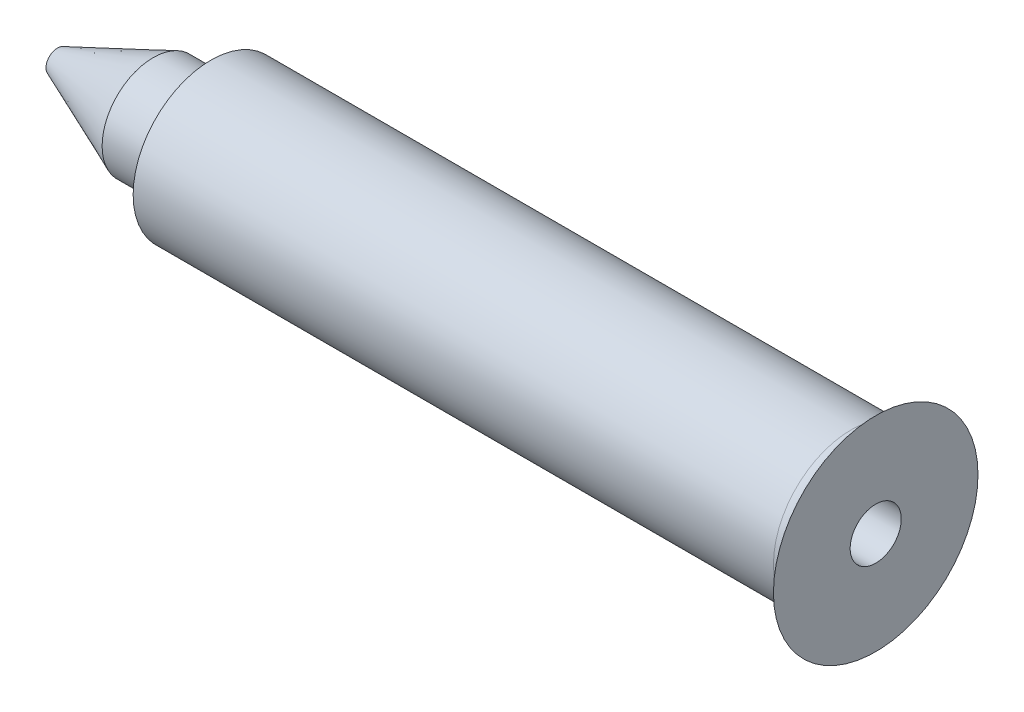
ISO-10303-21;
HEADER;
FILE_DESCRIPTION(('STEP AP214'),'2;1');
FILE_NAME('part.step','',(''),(''),'','','');
FILE_SCHEMA(('AUTOMOTIVE_DESIGN { 1 0 10303 214 1 1 1 1 }'));
ENDSEC;
DATA;
#1=APPLICATION_CONTEXT('core data for automotive mechanical design processes');
#2=APPLICATION_PROTOCOL_DEFINITION('international standard','automotive_design',2000,#1);
#3=PRODUCT_CONTEXT('',#1,'mechanical');
#4=PRODUCT('Part','Part','',(#3));
#5=PRODUCT_RELATED_PRODUCT_CATEGORY('part','',(#4));
#6=PRODUCT_DEFINITION_FORMATION('','',#4);
#7=PRODUCT_DEFINITION_CONTEXT('part definition',#1,'design');
#8=PRODUCT_DEFINITION('design','',#6,#7);
#9=PRODUCT_DEFINITION_SHAPE('','',#8);
#10=(LENGTH_UNIT() NAMED_UNIT(*) SI_UNIT(.MILLI.,.METRE.));
#11=(NAMED_UNIT(*) PLANE_ANGLE_UNIT() SI_UNIT($,.RADIAN.));
#12=(NAMED_UNIT(*) SI_UNIT($,.STERADIAN.) SOLID_ANGLE_UNIT());
#13=UNCERTAINTY_MEASURE_WITH_UNIT(LENGTH_MEASURE(1.E-05),#10,'distance_accuracy_value','');
#14=(GEOMETRIC_REPRESENTATION_CONTEXT(3) GLOBAL_UNCERTAINTY_ASSIGNED_CONTEXT((#13)) GLOBAL_UNIT_ASSIGNED_CONTEXT((#10,
#11,#12)) REPRESENTATION_CONTEXT('',''));
#15=CARTESIAN_POINT('',(0.,0.,0.));
#16=DIRECTION('',(0.,0.,1.));
#17=DIRECTION('',(1.,0.,0.));
#18=AXIS2_PLACEMENT_3D('',#15,#16,#17);
#19=CARTESIAN_POINT('',(2.97406968748741,0.,0.));
#20=DIRECTION('',(1.,0.,0.));
#21=DIRECTION('',(0.,0.,-1.));
#22=AXIS2_PLACEMENT_3D('',#19,#20,#21);
#23=CONICAL_SURFACE('',#22,1.5875,0.392699081698725);
#24=CARTESIAN_POINT('',(0.,0.,0.));
#25=DIRECTION('',(-1.,0.,0.));
#26=DIRECTION('',(0.,0.,1.));
#27=AXIS2_PLACEMENT_3D('',#24,#25,#26);
#28=CIRCLE('',#27,0.3556);
#29=CARTESIAN_POINT('',(0.,0.,-0.3556));
#30=VERTEX_POINT('',#29);
#31=EDGE_CURVE('E82',#30,#30,#28,.T.);
#32=CARTESIAN_POINT('',(2.97406968748741,0.,0.));
#33=DIRECTION('',(-1.,0.,0.));
#34=DIRECTION('',(0.,0.,1.));
#35=AXIS2_PLACEMENT_3D('',#32,#33,#34);
#36=CIRCLE('',#35,1.5875);
#37=CARTESIAN_POINT('',(2.97406968748741,0.,-1.5875));
#38=VERTEX_POINT('',#37);
#39=EDGE_CURVE('E10',#38,#38,#36,.T.);
#40=CARTESIAN_POINT('',(0.,0.,-0.3556));
#41=CARTESIAN_POINT('',(0.0309798925779943,0.,-0.368432291666667));
#42=CARTESIAN_POINT('',(0.0619597851559881,0.,-0.381264583333334));
#43=CARTESIAN_POINT('',(0.123919570311976,0.,-0.406929166666667));
#44=CARTESIAN_POINT('',(0.15489946288997,0.,-0.419761458333334));
#45=CARTESIAN_POINT('',(0.216859248045957,0.,-0.445426041666667));
#46=CARTESIAN_POINT('',(0.247839140623951,0.,-0.458258333333333));
#47=CARTESIAN_POINT('',(0.309798925779939,0.,-0.483922916666667));
#48=CARTESIAN_POINT('',(0.340778818357933,0.,-0.496755208333333));
#49=CARTESIAN_POINT('',(0.402738603513921,0.,-0.522419791666667));
#50=CARTESIAN_POINT('',(0.433718496091914,0.,-0.535252083333333));
#51=CARTESIAN_POINT('',(0.495678281247902,0.,-0.560916666666667));
#52=CARTESIAN_POINT('',(0.526658173825896,0.,-0.573748958333334));
#53=CARTESIAN_POINT('',(0.588617958981884,0.,-0.599413541666667));
#54=CARTESIAN_POINT('',(0.619597851559878,0.,-0.612245833333333));
#55=CARTESIAN_POINT('',(0.681557636715865,0.,-0.637910416666667));
#56=CARTESIAN_POINT('',(0.712537529293859,0.,-0.650742708333333));
#57=CARTESIAN_POINT('',(0.774497314449847,0.,-0.676407291666667));
#58=CARTESIAN_POINT('',(0.805477207027841,0.,-0.689239583333333));
#59=CARTESIAN_POINT('',(0.867436992183828,0.,-0.714904166666667));
#60=CARTESIAN_POINT('',(0.898416884761822,0.,-0.727736458333333));
#61=CARTESIAN_POINT('',(0.96037666991781,0.,-0.753401041666667));
#62=CARTESIAN_POINT('',(0.991356562495804,0.,-0.766233333333334));
#63=CARTESIAN_POINT('',(1.05331634765179,0.,-0.791897916666667));
#64=CARTESIAN_POINT('',(1.08429624022979,0.,-0.804730208333333));
#65=CARTESIAN_POINT('',(1.14625602538577,0.,-0.830394791666667));
#66=CARTESIAN_POINT('',(1.17723591796377,0.,-0.843227083333334));
#67=CARTESIAN_POINT('',(1.23919570311975,0.,-0.868891666666667));
#68=CARTESIAN_POINT('',(1.27017559569775,0.,-0.881723958333334));
#69=CARTESIAN_POINT('',(1.33213538085374,0.,-0.907388541666667));
#70=CARTESIAN_POINT('',(1.36311527343173,0.,-0.920220833333333));
#71=CARTESIAN_POINT('',(1.42507505858772,0.,-0.945885416666667));
#72=CARTESIAN_POINT('',(1.45605495116571,0.,-0.958717708333333));
#73=CARTESIAN_POINT('',(1.5180147363217,0.,-0.984382291666667));
#74=CARTESIAN_POINT('',(1.54899462889969,0.,-0.997214583333333));
#75=CARTESIAN_POINT('',(1.61095441405568,0.,-1.02287916666667));
#76=CARTESIAN_POINT('',(1.64193430663367,0.,-1.03571145833333));
#77=CARTESIAN_POINT('',(1.70389409178966,0.,-1.06137604166667));
#78=CARTESIAN_POINT('',(1.73487398436766,0.,-1.07420833333333));
#79=CARTESIAN_POINT('',(1.79683376952364,0.,-1.09987291666667));
#80=CARTESIAN_POINT('',(1.82781366210164,0.,-1.11270520833333));
#81=CARTESIAN_POINT('',(1.88977344725763,0.,-1.13836979166667));
#82=CARTESIAN_POINT('',(1.92075333983562,0.,-1.15120208333333));
#83=CARTESIAN_POINT('',(1.98271312499161,0.,-1.17686666666667));
#84=CARTESIAN_POINT('',(2.0136930175696,0.,-1.18969895833333));
#85=CARTESIAN_POINT('',(2.07565280272559,0.,-1.21536354166667));
#86=CARTESIAN_POINT('',(2.10663269530358,0.,-1.22819583333333));
#87=CARTESIAN_POINT('',(2.16859248045957,0.,-1.25386041666667));
#88=CARTESIAN_POINT('',(2.19957237303756,0.,-1.26669270833333));
#89=CARTESIAN_POINT('',(2.26153215819355,0.,-1.29235729166667));
#90=CARTESIAN_POINT('',(2.29251205077155,0.,-1.30518958333333));
#91=CARTESIAN_POINT('',(2.35447183592753,0.,-1.33085416666667));
#92=CARTESIAN_POINT('',(2.38545172850553,0.,-1.34368645833333));
#93=CARTESIAN_POINT('',(2.44741151366152,0.,-1.36935104166667));
#94=CARTESIAN_POINT('',(2.47839140623951,0.,-1.38218333333333));
#95=CARTESIAN_POINT('',(2.5403511913955,0.,-1.40784791666667));
#96=CARTESIAN_POINT('',(2.57133108397349,0.,-1.42068020833333));
#97=CARTESIAN_POINT('',(2.63329086912948,0.,-1.44634479166667));
#98=CARTESIAN_POINT('',(2.66427076170747,0.,-1.45917708333333));
#99=CARTESIAN_POINT('',(2.72623054686346,0.,-1.48484166666667));
#100=CARTESIAN_POINT('',(2.75721043944145,0.,-1.49767395833333));
#101=CARTESIAN_POINT('',(2.81917022459744,0.,-1.52333854166667));
#102=CARTESIAN_POINT('',(2.85015011717544,0.,-1.53617083333333));
#103=CARTESIAN_POINT('',(2.91210990233142,0.,-1.56183541666667));
#104=CARTESIAN_POINT('',(2.94308979490942,0.,-1.57466770833333));
#105=CARTESIAN_POINT('',(2.97406968748741,0.,-1.5875));
#106=B_SPLINE_CURVE_WITH_KNOTS('',3,(#40,#41,#42,#43,#44,#45,#46,#47,#48,#49,#50,#51,#52,#53,
#54,#55,#56,#57,#58,#59,#60,#61,#62,#63,#64,#65,#66,#67,#68,#69,#70,#71,#72,#73,#74,#75,#76,#77,
#78,#79,#80,#81,#82,#83,#84,#85,#86,#87,#88,#89,#90,#91,#92,#93,#94,#95,#96,#97,#98,#99,#100,
#101,#102,#103,#104,#105),.UNSPECIFIED.,.F.,.F.,(4,2,2,2,2,2,2,2,2,2,2,2,2,2,2,2,2,2,2,2,2,2,2,
2,2,2,2,2,2,2,2,2,4),(0.,0.10059718227695,0.201194364553901,0.301791546830851,0.402388729107801,
0.502985911384752,0.603583093661702,0.704180275938652,0.804777458215603,0.905374640492553,
1.0059718227695,1.10656900504645,1.2071661873234,1.30776336960035,1.40836055187731,
1.50895773415426,1.60955491643121,1.71015209870816,1.81074928098511,1.91134646326206,
2.01194364553901,2.11254082781596,2.21313801009291,2.31373519236986,2.41433237464681,
2.51492955692376,2.61552673920071,2.71612392147766,2.81672110375461,2.91731828603156,
3.01791546830851,3.11851265058546,3.21910983286241),.UNSPECIFIED.);
#107=EDGE_CURVE('BSEAM51',#30,#38,#106,.T.);
#108=ORIENTED_EDGE('',*,*,#31,.F.);
#109=ORIENTED_EDGE('',*,*,#39,.T.);
#110=ORIENTED_EDGE('',*,*,#107,.T.);
#111=ORIENTED_EDGE('',*,*,#107,.F.);
#112=EDGE_LOOP('',(#108,#110,#109,#111));
#113=FACE_BOUND('',#112,.T.);
#114=ADVANCED_FACE('F51',(#113),#23,.T.);
#115=CARTESIAN_POINT('',(0.,0.,0.));
#116=DIRECTION('',(-1.,0.,0.));
#117=DIRECTION('',(0.,0.,1.));
#118=AXIS2_PLACEMENT_3D('',#115,#116,#117);
#119=CYLINDRICAL_SURFACE('',#118,1.5875);
#120=ORIENTED_EDGE('',*,*,#39,.F.);
#121=EDGE_LOOP('',(#120));
#122=FACE_BOUND('',#121,.T.);
#123=CARTESIAN_POINT('',(4.7625,0.,0.));
#124=DIRECTION('',(-1.,0.,0.));
#125=DIRECTION('',(0.,0.,1.));
#126=AXIS2_PLACEMENT_3D('',#123,#124,#125);
#127=CIRCLE('',#126,1.5875);
#128=CARTESIAN_POINT('',(4.7625,0.,1.5875));
#129=VERTEX_POINT('',#128);
#130=EDGE_CURVE('E57',#129,#129,#127,.T.);
#131=ORIENTED_EDGE('',*,*,#130,.T.);
#132=EDGE_LOOP('',(#131));
#133=FACE_BOUND('',#132,.T.);
#134=ADVANCED_FACE('F89',(#122,#133),#119,.T.);
#135=CARTESIAN_POINT('',(4.7625,1.5875,0.));
#136=DIRECTION('',(1.,0.,0.));
#137=DIRECTION('',(0.,0.,-1.));
#138=AXIS2_PLACEMENT_3D('',#135,#136,#137);
#139=PLANE('',#138);
#140=ORIENTED_EDGE('',*,*,#130,.F.);
#141=EDGE_LOOP('',(#140));
#142=FACE_BOUND('',#141,.T.);
#143=CARTESIAN_POINT('',(4.7625,0.,0.));
#144=DIRECTION('',(-1.,0.,0.));
#145=DIRECTION('',(0.,0.,1.));
#146=AXIS2_PLACEMENT_3D('',#143,#144,#145);
#147=CIRCLE('',#146,2.413);
#148=CARTESIAN_POINT('',(4.7625,0.,2.413));
#149=VERTEX_POINT('',#148);
#150=EDGE_CURVE('E61',#149,#149,#147,.T.);
#151=ORIENTED_EDGE('',*,*,#150,.T.);
#152=EDGE_LOOP('',(#151));
#153=FACE_BOUND('',#152,.T.);
#154=ADVANCED_FACE('F93',(#142,#153),#139,.F.);
#155=CARTESIAN_POINT('',(0.,0.,0.));
#156=DIRECTION('',(-1.,0.,0.));
#157=DIRECTION('',(0.,0.,1.));
#158=AXIS2_PLACEMENT_3D('',#155,#156,#157);
#159=CYLINDRICAL_SURFACE('',#158,2.413);
#160=ORIENTED_EDGE('',*,*,#150,.F.);
#161=EDGE_LOOP('',(#160));
#162=FACE_BOUND('',#161,.T.);
#163=CARTESIAN_POINT('',(24.638,0.,0.));
#164=DIRECTION('',(-1.,0.,0.));
#165=DIRECTION('',(0.,0.,1.));
#166=AXIS2_PLACEMENT_3D('',#163,#164,#165);
#167=CIRCLE('',#166,2.413);
#168=CARTESIAN_POINT('',(24.638,0.,2.413));
#169=VERTEX_POINT('',#168);
#170=EDGE_CURVE('E65',#169,#169,#167,.T.);
#171=ORIENTED_EDGE('',*,*,#170,.T.);
#172=EDGE_LOOP('',(#171));
#173=FACE_BOUND('',#172,.T.);
#174=ADVANCED_FACE('F99',(#162,#173),#159,.T.);
#175=CARTESIAN_POINT('',(24.638,0.,0.));
#176=DIRECTION('',(-1.,0.,0.));
#177=DIRECTION('',(0.,0.,1.));
#178=AXIS2_PLACEMENT_3D('',#175,#176,#177);
#179=TOROIDAL_SURFACE('',#178,3.175,0.761999999999999);
#180=ORIENTED_EDGE('',*,*,#170,.F.);
#181=EDGE_LOOP('',(#180));
#182=FACE_BOUND('',#181,.T.);
#183=CARTESIAN_POINT('',(25.4,0.,0.));
#184=DIRECTION('',(-1.,0.,0.));
#185=DIRECTION('',(0.,0.,1.));
#186=AXIS2_PLACEMENT_3D('',#183,#184,#185);
#187=CIRCLE('',#186,3.175);
#188=CARTESIAN_POINT('',(25.4,0.,3.175));
#189=VERTEX_POINT('',#188);
#190=EDGE_CURVE('E70',#189,#189,#187,.T.);
#191=ORIENTED_EDGE('',*,*,#190,.T.);
#192=EDGE_LOOP('',(#191));
#193=FACE_BOUND('',#192,.T.);
#194=ADVANCED_FACE('F105',(#182,#193),#179,.F.);
#195=CARTESIAN_POINT('',(25.4,2.413,0.));
#196=DIRECTION('',(-1.,0.,0.));
#197=DIRECTION('',(0.,0.,1.));
#198=AXIS2_PLACEMENT_3D('',#195,#196,#197);
#199=PLANE('',#198);
#200=ORIENTED_EDGE('',*,*,#190,.F.);
#201=EDGE_LOOP('',(#200));
#202=FACE_BOUND('',#201,.T.);
#203=CARTESIAN_POINT('',(25.4,0.,0.));
#204=DIRECTION('',(-1.,0.,0.));
#205=DIRECTION('',(0.,0.,1.));
#206=AXIS2_PLACEMENT_3D('',#203,#204,#205);
#207=CIRCLE('',#206,0.793749999999999);
#208=CARTESIAN_POINT('',(25.4,0.,0.793749999999999));
#209=VERTEX_POINT('',#208);
#210=EDGE_CURVE('E73',#209,#209,#207,.T.);
#211=ORIENTED_EDGE('',*,*,#210,.T.);
#212=EDGE_LOOP('',(#211));
#213=FACE_BOUND('',#212,.T.);
#214=ADVANCED_FACE('F109',(#202,#213),#199,.F.);
#215=CARTESIAN_POINT('',(0.,0.,0.));
#216=DIRECTION('',(-1.,0.,0.));
#217=DIRECTION('',(0.,0.,1.));
#218=AXIS2_PLACEMENT_3D('',#215,#216,#217);
#219=CYLINDRICAL_SURFACE('',#218,0.793749999999999);
#220=ORIENTED_EDGE('',*,*,#210,.F.);
#221=EDGE_LOOP('',(#220));
#222=FACE_BOUND('',#221,.T.);
#223=CARTESIAN_POINT('',(1.5875,0.,0.));
#224=DIRECTION('',(-1.,0.,0.));
#225=DIRECTION('',(0.,0.,1.));
#226=AXIS2_PLACEMENT_3D('',#223,#224,#225);
#227=CIRCLE('',#226,0.79375);
#228=CARTESIAN_POINT('',(1.5875,0.,0.79375));
#229=VERTEX_POINT('',#228);
#230=EDGE_CURVE('E76',#229,#229,#227,.T.);
#231=ORIENTED_EDGE('',*,*,#230,.T.);
#232=EDGE_LOOP('',(#231));
#233=FACE_BOUND('',#232,.T.);
#234=ADVANCED_FACE('F113',(#222,#233),#219,.F.);
#235=CARTESIAN_POINT('',(1.5875,0.3556,0.));
#236=DIRECTION('',(-1.,0.,0.));
#237=DIRECTION('',(0.,0.,1.));
#238=AXIS2_PLACEMENT_3D('',#235,#236,#237);
#239=PLANE('',#238);
#240=ORIENTED_EDGE('',*,*,#230,.F.);
#241=EDGE_LOOP('',(#240));
#242=FACE_BOUND('',#241,.T.);
#243=CARTESIAN_POINT('',(1.5875,0.,0.));
#244=DIRECTION('',(-1.,0.,0.));
#245=DIRECTION('',(0.,0.,1.));
#246=AXIS2_PLACEMENT_3D('',#243,#244,#245);
#247=CIRCLE('',#246,0.3556);
#248=CARTESIAN_POINT('',(1.5875,0.,0.3556));
#249=VERTEX_POINT('',#248);
#250=EDGE_CURVE('E79',#249,#249,#247,.T.);
#251=ORIENTED_EDGE('',*,*,#250,.T.);
#252=EDGE_LOOP('',(#251));
#253=FACE_BOUND('',#252,.T.);
#254=ADVANCED_FACE('F117',(#242,#253),#239,.F.);
#255=CARTESIAN_POINT('',(0.,0.,0.));
#256=DIRECTION('',(-1.,0.,0.));
#257=DIRECTION('',(0.,0.,1.));
#258=AXIS2_PLACEMENT_3D('',#255,#256,#257);
#259=CYLINDRICAL_SURFACE('',#258,0.3556);
#260=ORIENTED_EDGE('',*,*,#250,.F.);
#261=EDGE_LOOP('',(#260));
#262=FACE_BOUND('',#261,.T.);
#263=ORIENTED_EDGE('',*,*,#31,.T.);
#264=EDGE_LOOP('',(#263));
#265=FACE_BOUND('',#264,.T.);
#266=ADVANCED_FACE('F86',(#262,#265),#259,.F.);
#267=CLOSED_SHELL('',(#114,#134,#154,#174,#194,#214,#234,#254,#266));
#268=MANIFOLD_SOLID_BREP('B2',#267);
#269=ADVANCED_BREP_SHAPE_REPRESENTATION('',(#18,#268),#14);
#270=SHAPE_DEFINITION_REPRESENTATION(#9,#269);
ENDSEC;
END-ISO-10303-21;
